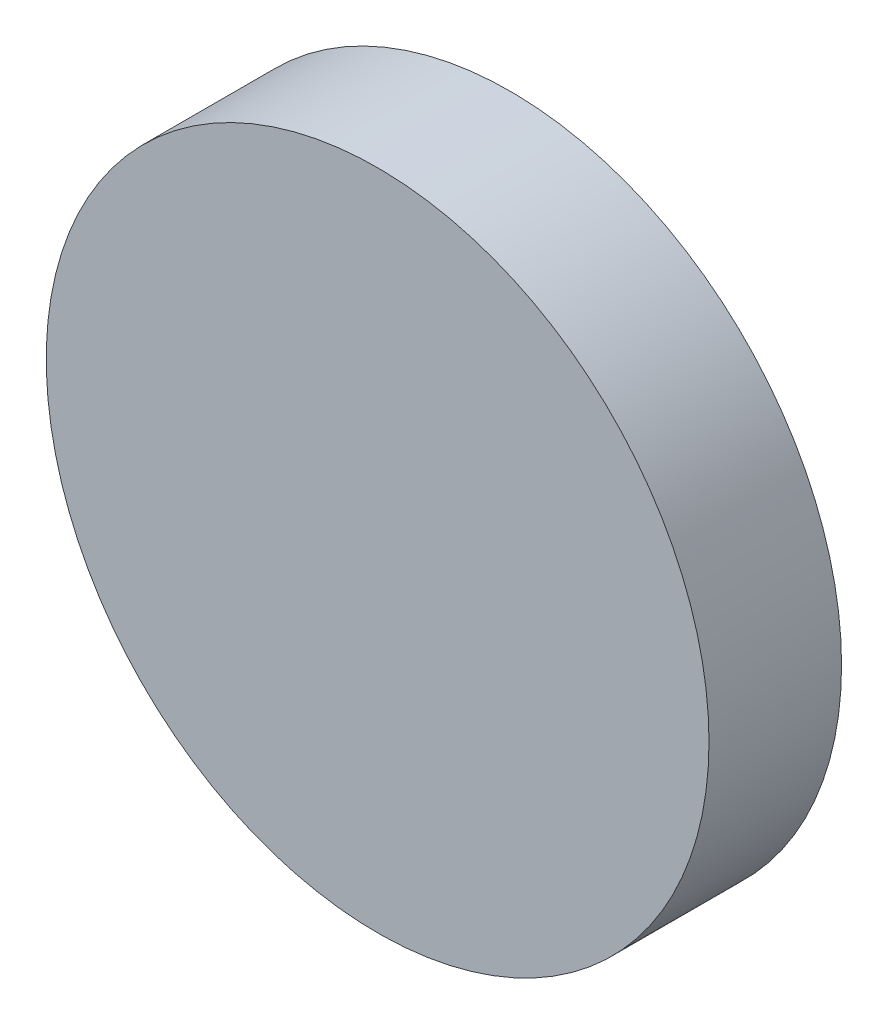
ISO-10303-21;
HEADER;
FILE_DESCRIPTION(('STEP AP214'),'2;1');
FILE_NAME('part.step','',(''),(''),'','','');
FILE_SCHEMA(('AUTOMOTIVE_DESIGN { 1 0 10303 214 1 1 1 1 }'));
ENDSEC;
DATA;
#1=APPLICATION_CONTEXT('core data for automotive mechanical design processes');
#2=APPLICATION_PROTOCOL_DEFINITION('international standard','automotive_design',2000,#1);
#3=PRODUCT_CONTEXT('',#1,'mechanical');
#4=PRODUCT('Part','Part','',(#3));
#5=PRODUCT_RELATED_PRODUCT_CATEGORY('part','',(#4));
#6=PRODUCT_DEFINITION_FORMATION('','',#4);
#7=PRODUCT_DEFINITION_CONTEXT('part definition',#1,'design');
#8=PRODUCT_DEFINITION('design','',#6,#7);
#9=PRODUCT_DEFINITION_SHAPE('','',#8);
#10=(LENGTH_UNIT() NAMED_UNIT(*) SI_UNIT(.MILLI.,.METRE.));
#11=(NAMED_UNIT(*) PLANE_ANGLE_UNIT() SI_UNIT($,.RADIAN.));
#12=(NAMED_UNIT(*) SI_UNIT($,.STERADIAN.) SOLID_ANGLE_UNIT());
#13=UNCERTAINTY_MEASURE_WITH_UNIT(LENGTH_MEASURE(1.E-05),#10,'distance_accuracy_value','');
#14=(GEOMETRIC_REPRESENTATION_CONTEXT(3) GLOBAL_UNCERTAINTY_ASSIGNED_CONTEXT((#13)) GLOBAL_UNIT_ASSIGNED_CONTEXT((#10,
#11,#12)) REPRESENTATION_CONTEXT('',''));
#15=CARTESIAN_POINT('',(0.,0.,0.));
#16=DIRECTION('',(0.,0.,1.));
#17=DIRECTION('',(1.,0.,0.));
#18=AXIS2_PLACEMENT_3D('',#15,#16,#17);
#19=CARTESIAN_POINT('',(-108.504553773926,-77.749220728237,2.));
#20=DIRECTION('',(0.,0.,-1.));
#21=DIRECTION('',(-1.,0.,0.));
#22=AXIS2_PLACEMENT_3D('',#19,#20,#21);
#23=CYLINDRICAL_SURFACE('',#22,5.00000000000001);
#24=CARTESIAN_POINT('',(-108.504553773926,-77.749220728237,2.));
#25=DIRECTION('',(0.,0.,1.));
#26=DIRECTION('',(1.,0.,0.));
#27=AXIS2_PLACEMENT_3D('',#24,#25,#26);
#28=CIRCLE('',#27,5.00000000000001);
#29=CARTESIAN_POINT('',(-103.504553773926,-77.749220728237,2.));
#30=VERTEX_POINT('',#29);
#31=EDGE_CURVE('E10',#30,#30,#28,.T.);
#32=ORIENTED_EDGE('',*,*,#31,.F.);
#33=EDGE_LOOP('',(#32));
#34=FACE_BOUND('',#33,.T.);
#35=CARTESIAN_POINT('',(-108.504553773926,-77.749220728237,0.));
#36=DIRECTION('',(0.,0.,1.));
#37=DIRECTION('',(1.,0.,0.));
#38=AXIS2_PLACEMENT_3D('',#35,#36,#37);
#39=CIRCLE('',#38,5.00000000000001);
#40=CARTESIAN_POINT('',(-103.504553773926,-77.749220728237,0.));
#41=VERTEX_POINT('',#40);
#42=EDGE_CURVE('E34',#41,#41,#39,.T.);
#43=ORIENTED_EDGE('',*,*,#42,.T.);
#44=EDGE_LOOP('',(#43));
#45=FACE_BOUND('',#44,.T.);
#46=ADVANCED_FACE('F31',(#34,#45),#23,.T.);
#47=CARTESIAN_POINT('',(-108.504553773926,-77.749220728237,2.));
#48=DIRECTION('',(0.,0.,1.));
#49=DIRECTION('',(1.,0.,0.));
#50=AXIS2_PLACEMENT_3D('',#47,#48,#49);
#51=PLANE('',#50);
#52=ORIENTED_EDGE('',*,*,#31,.T.);
#53=EDGE_LOOP('',(#52));
#54=FACE_BOUND('',#53,.T.);
#55=ADVANCED_FACE('F46',(#54),#51,.T.);
#56=CARTESIAN_POINT('',(-108.504553773926,-77.749220728237,0.));
#57=DIRECTION('',(0.,0.,1.));
#58=DIRECTION('',(1.,0.,0.));
#59=AXIS2_PLACEMENT_3D('',#56,#57,#58);
#60=PLANE('',#59);
#61=ORIENTED_EDGE('',*,*,#42,.F.);
#62=EDGE_LOOP('',(#61));
#63=FACE_BOUND('',#62,.T.);
#64=ADVANCED_FACE('F44',(#63),#60,.F.);
#65=CLOSED_SHELL('',(#46,#55,#64));
#66=MANIFOLD_SOLID_BREP('B2',#65);
#67=ADVANCED_BREP_SHAPE_REPRESENTATION('',(#18,#66),#14);
#68=SHAPE_DEFINITION_REPRESENTATION(#9,#67);
ENDSEC;
END-ISO-10303-21;
